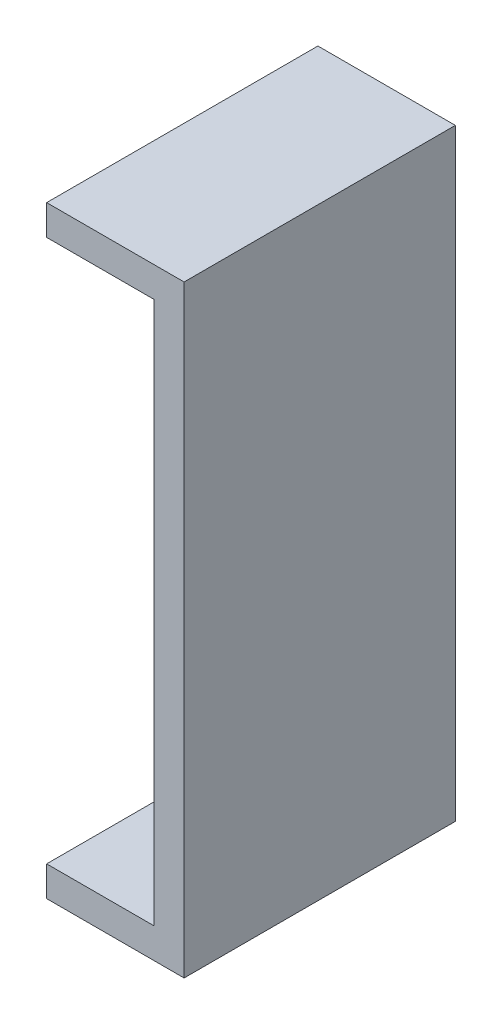
ISO-10303-21;
HEADER;
FILE_DESCRIPTION(('STEP AP214'),'2;1');
FILE_NAME('part.step','',(''),(''),'','','');
FILE_SCHEMA(('AUTOMOTIVE_DESIGN { 1 0 10303 214 1 1 1 1 }'));
ENDSEC;
DATA;
#1=APPLICATION_CONTEXT('core data for automotive mechanical design processes');
#2=APPLICATION_PROTOCOL_DEFINITION('international standard','automotive_design',2000,#1);
#3=PRODUCT_CONTEXT('',#1,'mechanical');
#4=PRODUCT('Part','Part','',(#3));
#5=PRODUCT_RELATED_PRODUCT_CATEGORY('part','',(#4));
#6=PRODUCT_DEFINITION_FORMATION('','',#4);
#7=PRODUCT_DEFINITION_CONTEXT('part definition',#1,'design');
#8=PRODUCT_DEFINITION('design','',#6,#7);
#9=PRODUCT_DEFINITION_SHAPE('','',#8);
#10=(LENGTH_UNIT() NAMED_UNIT(*) SI_UNIT(.MILLI.,.METRE.));
#11=(NAMED_UNIT(*) PLANE_ANGLE_UNIT() SI_UNIT($,.RADIAN.));
#12=(NAMED_UNIT(*) SI_UNIT($,.STERADIAN.) SOLID_ANGLE_UNIT());
#13=UNCERTAINTY_MEASURE_WITH_UNIT(LENGTH_MEASURE(1.E-05),#10,'distance_accuracy_value','');
#14=(GEOMETRIC_REPRESENTATION_CONTEXT(3) GLOBAL_UNCERTAINTY_ASSIGNED_CONTEXT((#13)) GLOBAL_UNIT_ASSIGNED_CONTEXT((#10,
#11,#12)) REPRESENTATION_CONTEXT('',''));
#15=CARTESIAN_POINT('',(0.,0.,0.));
#16=DIRECTION('',(0.,0.,1.));
#17=DIRECTION('',(1.,0.,0.));
#18=AXIS2_PLACEMENT_3D('',#15,#16,#17);
#19=CARTESIAN_POINT('',(37.5,-50.,45.));
#20=DIRECTION('',(-1.,0.,0.));
#21=DIRECTION('',(0.,0.,1.));
#22=AXIS2_PLACEMENT_3D('',#19,#20,#21);
#23=PLANE('',#22);
#24=DIRECTION('',(0.,1.,0.));
#25=VECTOR('',#24,1.);
#26=CARTESIAN_POINT('',(37.5,-50.,0.));
#27=LINE('',#26,#25);
#28=CARTESIAN_POINT('',(37.5,-50.,0.));
#29=VERTEX_POINT('',#28);
#30=CARTESIAN_POINT('',(37.5,50.,0.));
#31=VERTEX_POINT('',#30);
#32=EDGE_CURVE('E172',#29,#31,#27,.T.);
#33=ORIENTED_EDGE('',*,*,#32,.T.);
#34=DIRECTION('',(0.,0.,-1.));
#35=VECTOR('',#34,1.);
#36=CARTESIAN_POINT('',(37.5,50.,45.));
#37=LINE('',#36,#35);
#38=CARTESIAN_POINT('',(37.5,50.,45.));
#39=VERTEX_POINT('',#38);
#40=EDGE_CURVE('E165',#39,#31,#37,.T.);
#41=ORIENTED_EDGE('',*,*,#40,.F.);
#42=DIRECTION('',(0.,1.,0.));
#43=VECTOR('',#42,1.);
#44=CARTESIAN_POINT('',(37.5,-50.,45.));
#45=LINE('',#44,#43);
#46=CARTESIAN_POINT('',(37.5,-50.,45.));
#47=VERTEX_POINT('',#46);
#48=EDGE_CURVE('E178',#47,#39,#45,.T.);
#49=ORIENTED_EDGE('',*,*,#48,.F.);
#50=DIRECTION('',(0.,0.,-1.));
#51=VECTOR('',#50,1.);
#52=CARTESIAN_POINT('',(37.5,-50.,45.));
#53=LINE('',#52,#51);
#54=EDGE_CURVE('E84',#47,#29,#53,.T.);
#55=ORIENTED_EDGE('',*,*,#54,.T.);
#56=EDGE_LOOP('',(#33,#41,#49,#55));
#57=FACE_BOUND('',#56,.T.);
#58=ADVANCED_FACE('F75',(#57),#23,.F.);
#59=CARTESIAN_POINT('',(32.5,0.,0.));
#60=DIRECTION('',(1.,0.,0.));
#61=DIRECTION('',(0.,0.,-1.));
#62=AXIS2_PLACEMENT_3D('',#59,#60,#61);
#63=PLANE('',#62);
#64=DIRECTION('',(0.,1.,0.));
#65=VECTOR('',#64,1.);
#66=CARTESIAN_POINT('',(32.5,0.,45.));
#67=LINE('',#66,#65);
#68=CARTESIAN_POINT('',(32.5,-45.,45.));
#69=VERTEX_POINT('',#68);
#70=CARTESIAN_POINT('',(32.5,45.,45.));
#71=VERTEX_POINT('',#70);
#72=EDGE_CURVE('E203',#69,#71,#67,.T.);
#73=ORIENTED_EDGE('',*,*,#72,.T.);
#74=DIRECTION('',(0.,0.,1.));
#75=VECTOR('',#74,1.);
#76=CARTESIAN_POINT('',(32.5,45.,0.));
#77=LINE('',#76,#75);
#78=CARTESIAN_POINT('',(32.5,45.,0.));
#79=VERTEX_POINT('',#78);
#80=EDGE_CURVE('E175',#79,#71,#77,.T.);
#81=ORIENTED_EDGE('',*,*,#80,.F.);
#82=DIRECTION('',(0.,1.,0.));
#83=VECTOR('',#82,1.);
#84=CARTESIAN_POINT('',(32.5,0.,0.));
#85=LINE('',#84,#83);
#86=CARTESIAN_POINT('',(32.5,-45.,0.));
#87=VERTEX_POINT('',#86);
#88=EDGE_CURVE('E204',#87,#79,#85,.T.);
#89=ORIENTED_EDGE('',*,*,#88,.F.);
#90=DIRECTION('',(0.,0.,1.));
#91=VECTOR('',#90,1.);
#92=CARTESIAN_POINT('',(32.5,-45.,0.));
#93=LINE('',#92,#91);
#94=EDGE_CURVE('E168',#87,#69,#93,.T.);
#95=ORIENTED_EDGE('',*,*,#94,.T.);
#96=EDGE_LOOP('',(#73,#81,#89,#95));
#97=FACE_BOUND('',#96,.T.);
#98=ADVANCED_FACE('F236',(#97),#63,.F.);
#99=CARTESIAN_POINT('',(37.5,50.,45.));
#100=DIRECTION('',(0.,-1.,0.));
#101=DIRECTION('',(0.,0.,-1.));
#102=AXIS2_PLACEMENT_3D('',#99,#100,#101);
#103=PLANE('',#102);
#104=DIRECTION('',(0.,0.,1.));
#105=VECTOR('',#104,1.);
#106=CARTESIAN_POINT('',(14.6971430828023,50.,0.));
#107=LINE('',#106,#105);
#108=CARTESIAN_POINT('',(14.6971430828023,50.,0.));
#109=VERTEX_POINT('',#108);
#110=CARTESIAN_POINT('',(14.6971430828023,50.,45.));
#111=VERTEX_POINT('',#110);
#112=EDGE_CURVE('E138',#109,#111,#107,.T.);
#113=ORIENTED_EDGE('',*,*,#112,.T.);
#114=DIRECTION('',(-1.,0.,0.));
#115=VECTOR('',#114,1.);
#116=CARTESIAN_POINT('',(37.5,50.,45.));
#117=LINE('',#116,#115);
#118=EDGE_CURVE('E183',#39,#111,#117,.T.);
#119=ORIENTED_EDGE('',*,*,#118,.F.);
#120=ORIENTED_EDGE('',*,*,#40,.T.);
#121=DIRECTION('',(-1.,0.,0.));
#122=VECTOR('',#121,1.);
#123=CARTESIAN_POINT('',(37.5,50.,0.));
#124=LINE('',#123,#122);
#125=EDGE_CURVE('E156',#31,#109,#124,.T.);
#126=ORIENTED_EDGE('',*,*,#125,.T.);
#127=EDGE_LOOP('',(#113,#119,#120,#126));
#128=FACE_BOUND('',#127,.T.);
#129=ADVANCED_FACE('F77',(#128),#103,.F.);
#130=CARTESIAN_POINT('',(0.,45.,0.));
#131=DIRECTION('',(0.,1.,0.));
#132=DIRECTION('',(-1.,0.,0.));
#133=AXIS2_PLACEMENT_3D('',#130,#131,#132);
#134=PLANE('',#133);
#135=DIRECTION('',(0.,0.,1.));
#136=VECTOR('',#135,1.);
#137=CARTESIAN_POINT('',(14.6971430828023,45.,0.));
#138=LINE('',#137,#136);
#139=CARTESIAN_POINT('',(14.6971430828023,45.,0.));
#140=VERTEX_POINT('',#139);
#141=CARTESIAN_POINT('',(14.6971430828023,45.,45.));
#142=VERTEX_POINT('',#141);
#143=EDGE_CURVE('E12',#140,#142,#138,.T.);
#144=ORIENTED_EDGE('',*,*,#143,.F.);
#145=DIRECTION('',(-1.,0.,0.));
#146=VECTOR('',#145,1.);
#147=CARTESIAN_POINT('',(0.,45.,0.));
#148=LINE('',#147,#146);
#149=EDGE_CURVE('E159',#79,#140,#148,.T.);
#150=ORIENTED_EDGE('',*,*,#149,.F.);
#151=ORIENTED_EDGE('',*,*,#80,.T.);
#152=DIRECTION('',(-1.,0.,0.));
#153=VECTOR('',#152,1.);
#154=CARTESIAN_POINT('',(0.,45.,45.));
#155=LINE('',#154,#153);
#156=EDGE_CURVE('E215',#71,#142,#155,.T.);
#157=ORIENTED_EDGE('',*,*,#156,.T.);
#158=EDGE_LOOP('',(#144,#150,#151,#157));
#159=FACE_BOUND('',#158,.T.);
#160=ADVANCED_FACE('F233',(#159),#134,.F.);
#161=CARTESIAN_POINT('',(0.,-45.,0.));
#162=DIRECTION('',(0.,-1.,0.));
#163=DIRECTION('',(0.,0.,-1.));
#164=AXIS2_PLACEMENT_3D('',#161,#162,#163);
#165=PLANE('',#164);
#166=DIRECTION('',(0.,0.,-1.));
#167=VECTOR('',#166,1.);
#168=CARTESIAN_POINT('',(14.6971430828023,-45.,0.));
#169=LINE('',#168,#167);
#170=CARTESIAN_POINT('',(14.6971430828023,-45.,45.));
#171=VERTEX_POINT('',#170);
#172=CARTESIAN_POINT('',(14.6971430828023,-45.,0.));
#173=VERTEX_POINT('',#172);
#174=EDGE_CURVE('E147',#171,#173,#169,.T.);
#175=ORIENTED_EDGE('',*,*,#174,.F.);
#176=DIRECTION('',(1.,0.,0.));
#177=VECTOR('',#176,1.);
#178=CARTESIAN_POINT('',(0.,-45.,45.));
#179=LINE('',#178,#177);
#180=EDGE_CURVE('E207',#171,#69,#179,.T.);
#181=ORIENTED_EDGE('',*,*,#180,.T.);
#182=ORIENTED_EDGE('',*,*,#94,.F.);
#183=DIRECTION('',(1.,0.,0.));
#184=VECTOR('',#183,1.);
#185=CARTESIAN_POINT('',(0.,-45.,0.));
#186=LINE('',#185,#184);
#187=EDGE_CURVE('E210',#173,#87,#186,.T.);
#188=ORIENTED_EDGE('',*,*,#187,.F.);
#189=EDGE_LOOP('',(#175,#181,#182,#188));
#190=FACE_BOUND('',#189,.T.);
#191=ADVANCED_FACE('F240',(#190),#165,.F.);
#192=CARTESIAN_POINT('',(37.5,-50.,45.));
#193=DIRECTION('',(0.,1.,0.));
#194=DIRECTION('',(0.,0.,1.));
#195=AXIS2_PLACEMENT_3D('',#192,#193,#194);
#196=PLANE('',#195);
#197=DIRECTION('',(0.,0.,1.));
#198=VECTOR('',#197,1.);
#199=CARTESIAN_POINT('',(14.6971430828023,-50.,0.));
#200=LINE('',#199,#198);
#201=CARTESIAN_POINT('',(14.6971430828023,-50.,0.));
#202=VERTEX_POINT('',#201);
#203=CARTESIAN_POINT('',(14.6971430828023,-50.,45.));
#204=VERTEX_POINT('',#203);
#205=EDGE_CURVE('E148',#202,#204,#200,.T.);
#206=ORIENTED_EDGE('',*,*,#205,.F.);
#207=DIRECTION('',(1.,0.,0.));
#208=VECTOR('',#207,1.);
#209=CARTESIAN_POINT('',(37.5,-50.,0.));
#210=LINE('',#209,#208);
#211=EDGE_CURVE('E167',#202,#29,#210,.T.);
#212=ORIENTED_EDGE('',*,*,#211,.T.);
#213=ORIENTED_EDGE('',*,*,#54,.F.);
#214=DIRECTION('',(1.,0.,0.));
#215=VECTOR('',#214,1.);
#216=CARTESIAN_POINT('',(37.5,-50.,45.));
#217=LINE('',#216,#215);
#218=EDGE_CURVE('E196',#204,#47,#217,.T.);
#219=ORIENTED_EDGE('',*,*,#218,.F.);
#220=EDGE_LOOP('',(#206,#212,#213,#219));
#221=FACE_BOUND('',#220,.T.);
#222=ADVANCED_FACE('F195',(#221),#196,.F.);
#223=CARTESIAN_POINT('',(0.,0.,0.));
#224=DIRECTION('',(0.,0.,-1.));
#225=DIRECTION('',(-1.,0.,0.));
#226=AXIS2_PLACEMENT_3D('',#223,#224,#225);
#227=PLANE('',#226);
#228=ORIENTED_EDGE('',*,*,#211,.F.);
#229=DIRECTION('',(0.,-1.,0.));
#230=VECTOR('',#229,1.);
#231=CARTESIAN_POINT('',(14.6971430828023,50.,0.));
#232=LINE('',#231,#230);
#233=EDGE_CURVE('E161',#173,#202,#232,.T.);
#234=ORIENTED_EDGE('',*,*,#233,.F.);
#235=ORIENTED_EDGE('',*,*,#187,.T.);
#236=ORIENTED_EDGE('',*,*,#88,.T.);
#237=ORIENTED_EDGE('',*,*,#149,.T.);
#238=EDGE_CURVE('E98',#109,#140,#232,.T.);
#239=ORIENTED_EDGE('',*,*,#238,.F.);
#240=ORIENTED_EDGE('',*,*,#125,.F.);
#241=ORIENTED_EDGE('',*,*,#32,.F.);
#242=EDGE_LOOP('',(#228,#234,#235,#236,#237,#239,#240,#241));
#243=FACE_BOUND('',#242,.T.);
#244=ADVANCED_FACE('F154',(#243),#227,.T.);
#245=CARTESIAN_POINT('',(0.,0.,45.));
#246=DIRECTION('',(0.,0.,-1.));
#247=DIRECTION('',(-1.,0.,0.));
#248=AXIS2_PLACEMENT_3D('',#245,#246,#247);
#249=PLANE('',#248);
#250=DIRECTION('',(0.,-1.,0.));
#251=VECTOR('',#250,1.);
#252=CARTESIAN_POINT('',(14.6971430828023,50.,45.));
#253=LINE('',#252,#251);
#254=EDGE_CURVE('E91',#171,#204,#253,.T.);
#255=ORIENTED_EDGE('',*,*,#254,.T.);
#256=ORIENTED_EDGE('',*,*,#218,.T.);
#257=ORIENTED_EDGE('',*,*,#48,.T.);
#258=ORIENTED_EDGE('',*,*,#118,.T.);
#259=EDGE_CURVE('E141',#111,#142,#253,.T.);
#260=ORIENTED_EDGE('',*,*,#259,.T.);
#261=ORIENTED_EDGE('',*,*,#156,.F.);
#262=ORIENTED_EDGE('',*,*,#72,.F.);
#263=ORIENTED_EDGE('',*,*,#180,.F.);
#264=EDGE_LOOP('',(#255,#256,#257,#258,#260,#261,#262,#263));
#265=FACE_BOUND('',#264,.T.);
#266=ADVANCED_FACE('F228',(#265),#249,.F.);
#267=CARTESIAN_POINT('',(14.6971430828023,50.,0.));
#268=DIRECTION('',(-1.,0.,0.));
#269=DIRECTION('',(0.,0.,1.));
#270=AXIS2_PLACEMENT_3D('',#267,#268,#269);
#271=PLANE('',#270);
#272=ORIENTED_EDGE('',*,*,#143,.T.);
#273=ORIENTED_EDGE('',*,*,#259,.F.);
#274=ORIENTED_EDGE('',*,*,#112,.F.);
#275=ORIENTED_EDGE('',*,*,#238,.T.);
#276=EDGE_LOOP('',(#272,#273,#274,#275));
#277=FACE_BOUND('',#276,.T.);
#278=ADVANCED_FACE('F139',(#277),#271,.T.);
#279=ORIENTED_EDGE('',*,*,#174,.T.);
#280=ORIENTED_EDGE('',*,*,#233,.T.);
#281=ORIENTED_EDGE('',*,*,#205,.T.);
#282=ORIENTED_EDGE('',*,*,#254,.F.);
#283=EDGE_LOOP('',(#279,#280,#281,#282));
#284=FACE_BOUND('',#283,.T.);
#285=ADVANCED_FACE('F241',(#284),#271,.T.);
#286=CLOSED_SHELL('',(#58,#98,#129,#160,#191,#222,#244,#266,#278,#285));
#287=MANIFOLD_SOLID_BREP('B2',#286);
#288=ADVANCED_BREP_SHAPE_REPRESENTATION('',(#18,#287),#14);
#289=SHAPE_DEFINITION_REPRESENTATION(#9,#288);
ENDSEC;
END-ISO-10303-21;
